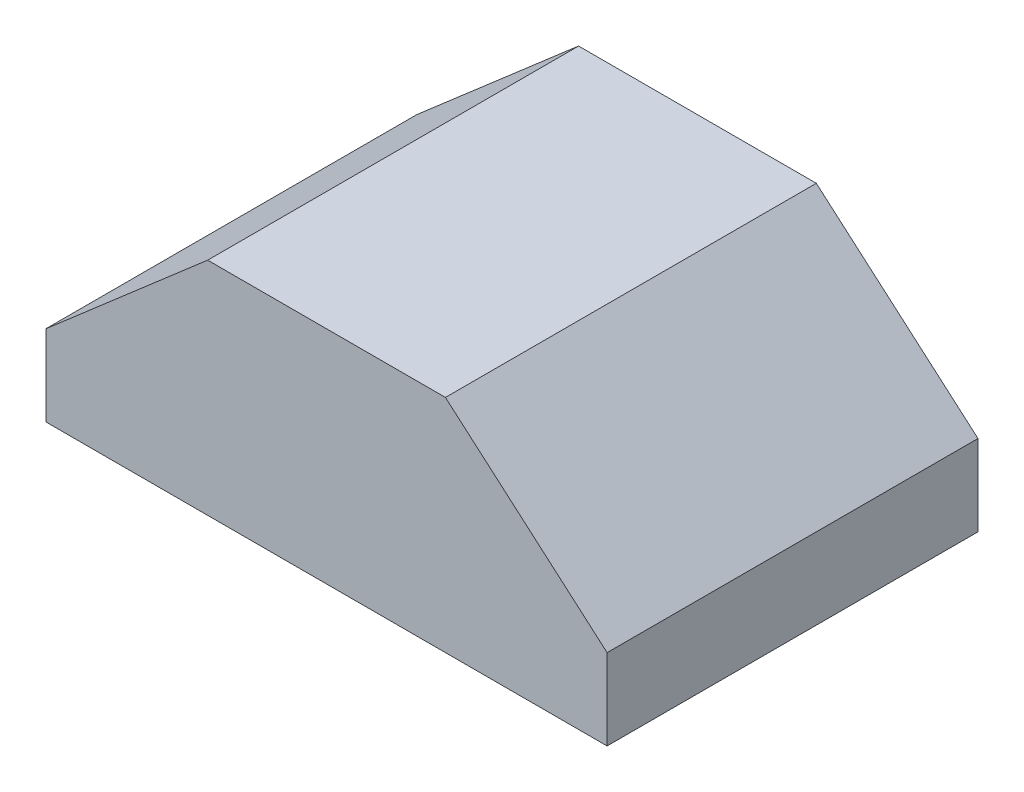
ISO-10303-21;
HEADER;
FILE_DESCRIPTION(('STEP AP214'),'2;1');
FILE_NAME('part.step','',(''),(''),'','','');
FILE_SCHEMA(('AUTOMOTIVE_DESIGN { 1 0 10303 214 1 1 1 1 }'));
ENDSEC;
DATA;
#1=APPLICATION_CONTEXT('core data for automotive mechanical design processes');
#2=APPLICATION_PROTOCOL_DEFINITION('international standard','automotive_design',2000,#1);
#3=PRODUCT_CONTEXT('',#1,'mechanical');
#4=PRODUCT('Part','Part','',(#3));
#5=PRODUCT_RELATED_PRODUCT_CATEGORY('part','',(#4));
#6=PRODUCT_DEFINITION_FORMATION('','',#4);
#7=PRODUCT_DEFINITION_CONTEXT('part definition',#1,'design');
#8=PRODUCT_DEFINITION('design','',#6,#7);
#9=PRODUCT_DEFINITION_SHAPE('','',#8);
#10=(LENGTH_UNIT() NAMED_UNIT(*) SI_UNIT(.MILLI.,.METRE.));
#11=(NAMED_UNIT(*) PLANE_ANGLE_UNIT() SI_UNIT($,.RADIAN.));
#12=(NAMED_UNIT(*) SI_UNIT($,.STERADIAN.) SOLID_ANGLE_UNIT());
#13=UNCERTAINTY_MEASURE_WITH_UNIT(LENGTH_MEASURE(1.E-05),#10,'distance_accuracy_value','');
#14=(GEOMETRIC_REPRESENTATION_CONTEXT(3) GLOBAL_UNCERTAINTY_ASSIGNED_CONTEXT((#13)) GLOBAL_UNIT_ASSIGNED_CONTEXT((#10,
#11,#12)) REPRESENTATION_CONTEXT('',''));
#15=CARTESIAN_POINT('',(0.,0.,0.));
#16=DIRECTION('',(0.,0.,1.));
#17=DIRECTION('',(1.,0.,0.));
#18=AXIS2_PLACEMENT_3D('',#15,#16,#17);
#19=CARTESIAN_POINT('',(-2950.,850.,3900.));
#20=DIRECTION('',(1.,0.,0.));
#21=DIRECTION('',(0.,0.,-1.));
#22=AXIS2_PLACEMENT_3D('',#19,#20,#21);
#23=PLANE('',#22);
#24=DIRECTION('',(0.,-1.,0.));
#25=VECTOR('',#24,1.);
#26=CARTESIAN_POINT('',(-2950.,850.,0.));
#27=LINE('',#26,#25);
#28=CARTESIAN_POINT('',(-2950.,850.,0.));
#29=VERTEX_POINT('',#28);
#30=CARTESIAN_POINT('',(-2950.,3.56795033927606E-13,0.));
#31=VERTEX_POINT('',#30);
#32=EDGE_CURVE('E119',#29,#31,#27,.T.);
#33=ORIENTED_EDGE('',*,*,#32,.T.);
#34=DIRECTION('',(0.,0.,-1.));
#35=VECTOR('',#34,1.);
#36=CARTESIAN_POINT('',(-2950.,3.56795033927606E-13,3900.));
#37=LINE('',#36,#35);
#38=CARTESIAN_POINT('',(-2950.,3.56795033927606E-13,3900.));
#39=VERTEX_POINT('',#38);
#40=EDGE_CURVE('E11',#39,#31,#37,.T.);
#41=ORIENTED_EDGE('',*,*,#40,.F.);
#42=DIRECTION('',(0.,-1.,0.));
#43=VECTOR('',#42,1.);
#44=CARTESIAN_POINT('',(-2950.,850.,3900.));
#45=LINE('',#44,#43);
#46=CARTESIAN_POINT('',(-2950.,850.,3900.));
#47=VERTEX_POINT('',#46);
#48=EDGE_CURVE('E129',#47,#39,#45,.T.);
#49=ORIENTED_EDGE('',*,*,#48,.F.);
#50=DIRECTION('',(0.,0.,-1.));
#51=VECTOR('',#50,1.);
#52=CARTESIAN_POINT('',(-2950.,850.,3900.));
#53=LINE('',#52,#51);
#54=EDGE_CURVE('E115',#47,#29,#53,.T.);
#55=ORIENTED_EDGE('',*,*,#54,.T.);
#56=EDGE_LOOP('',(#33,#41,#49,#55));
#57=FACE_BOUND('',#56,.T.);
#58=ADVANCED_FACE('F35',(#57),#23,.F.);
#59=CARTESIAN_POINT('',(2950.,3.56795033927606E-13,3900.));
#60=DIRECTION('',(0.,1.,0.));
#61=DIRECTION('',(0.,0.,1.));
#62=AXIS2_PLACEMENT_3D('',#59,#60,#61);
#63=PLANE('',#62);
#64=DIRECTION('',(1.,0.,0.));
#65=VECTOR('',#64,1.);
#66=CARTESIAN_POINT('',(2950.,3.56795033927606E-13,0.));
#67=LINE('',#66,#65);
#68=CARTESIAN_POINT('',(2950.,3.56795033927606E-13,0.));
#69=VERTEX_POINT('',#68);
#70=EDGE_CURVE('E122',#31,#69,#67,.T.);
#71=ORIENTED_EDGE('',*,*,#70,.T.);
#72=DIRECTION('',(0.,0.,-1.));
#73=VECTOR('',#72,1.);
#74=CARTESIAN_POINT('',(2950.,3.56795033927606E-13,3900.));
#75=LINE('',#74,#73);
#76=CARTESIAN_POINT('',(2950.,3.56795033927606E-13,3900.));
#77=VERTEX_POINT('',#76);
#78=EDGE_CURVE('E43',#77,#69,#75,.T.);
#79=ORIENTED_EDGE('',*,*,#78,.F.);
#80=DIRECTION('',(1.,0.,0.));
#81=VECTOR('',#80,1.);
#82=CARTESIAN_POINT('',(2950.,3.56795033927606E-13,3900.));
#83=LINE('',#82,#81);
#84=EDGE_CURVE('E88',#39,#77,#83,.T.);
#85=ORIENTED_EDGE('',*,*,#84,.F.);
#86=ORIENTED_EDGE('',*,*,#40,.T.);
#87=EDGE_LOOP('',(#71,#79,#85,#86));
#88=FACE_BOUND('',#87,.T.);
#89=ADVANCED_FACE('F153',(#88),#63,.F.);
#90=CARTESIAN_POINT('',(2950.,850.,3900.));
#91=DIRECTION('',(-1.,0.,0.));
#92=DIRECTION('',(0.,0.,1.));
#93=AXIS2_PLACEMENT_3D('',#90,#91,#92);
#94=PLANE('',#93);
#95=DIRECTION('',(0.,1.,0.));
#96=VECTOR('',#95,1.);
#97=CARTESIAN_POINT('',(2950.,850.,0.));
#98=LINE('',#97,#96);
#99=CARTESIAN_POINT('',(2950.,850.,0.));
#100=VERTEX_POINT('',#99);
#101=EDGE_CURVE('E124',#69,#100,#98,.T.);
#102=ORIENTED_EDGE('',*,*,#101,.T.);
#103=DIRECTION('',(0.,0.,-1.));
#104=VECTOR('',#103,1.);
#105=CARTESIAN_POINT('',(2950.,850.,3900.));
#106=LINE('',#105,#104);
#107=CARTESIAN_POINT('',(2950.,850.,3900.));
#108=VERTEX_POINT('',#107);
#109=EDGE_CURVE('E110',#108,#100,#106,.T.);
#110=ORIENTED_EDGE('',*,*,#109,.F.);
#111=DIRECTION('',(0.,1.,0.));
#112=VECTOR('',#111,1.);
#113=CARTESIAN_POINT('',(2950.,850.,3900.));
#114=LINE('',#113,#112);
#115=EDGE_CURVE('E101',#77,#108,#114,.T.);
#116=ORIENTED_EDGE('',*,*,#115,.F.);
#117=ORIENTED_EDGE('',*,*,#78,.T.);
#118=EDGE_LOOP('',(#102,#110,#116,#117));
#119=FACE_BOUND('',#118,.T.);
#120=ADVANCED_FACE('F135',(#119),#94,.F.);
#121=CARTESIAN_POINT('',(1250.,2323.94029729837,3900.));
#122=DIRECTION('',(-0.655084576577052,-0.755555555555556,0.));
#123=DIRECTION('',(0.755555555555556,-0.655084576577052,0.));
#124=AXIS2_PLACEMENT_3D('',#121,#122,#123);
#125=PLANE('',#124);
#126=DIRECTION('',(-0.755555555555556,0.655084576577052,0.));
#127=VECTOR('',#126,1.);
#128=CARTESIAN_POINT('',(1250.,2323.94029729837,0.));
#129=LINE('',#128,#127);
#130=CARTESIAN_POINT('',(1250.,2323.94029729837,0.));
#131=VERTEX_POINT('',#130);
#132=EDGE_CURVE('E109',#100,#131,#129,.T.);
#133=ORIENTED_EDGE('',*,*,#132,.T.);
#134=DIRECTION('',(0.,0.,-1.));
#135=VECTOR('',#134,1.);
#136=CARTESIAN_POINT('',(1250.,2323.94029729837,3900.));
#137=LINE('',#136,#135);
#138=CARTESIAN_POINT('',(1250.,2323.94029729837,3900.));
#139=VERTEX_POINT('',#138);
#140=EDGE_CURVE('E106',#139,#131,#137,.T.);
#141=ORIENTED_EDGE('',*,*,#140,.F.);
#142=DIRECTION('',(-0.755555555555556,0.655084576577052,0.));
#143=VECTOR('',#142,1.);
#144=CARTESIAN_POINT('',(1250.,2323.94029729837,3900.));
#145=LINE('',#144,#143);
#146=EDGE_CURVE('E95',#108,#139,#145,.T.);
#147=ORIENTED_EDGE('',*,*,#146,.F.);
#148=ORIENTED_EDGE('',*,*,#109,.T.);
#149=EDGE_LOOP('',(#133,#141,#147,#148));
#150=FACE_BOUND('',#149,.T.);
#151=ADVANCED_FACE('F107',(#150),#125,.F.);
#152=CARTESIAN_POINT('',(-1250.,2323.94029729837,3900.));
#153=DIRECTION('',(0.,-1.,0.));
#154=DIRECTION('',(0.,0.,-1.));
#155=AXIS2_PLACEMENT_3D('',#152,#153,#154);
#156=PLANE('',#155);
#157=DIRECTION('',(-1.,0.,0.));
#158=VECTOR('',#157,1.);
#159=CARTESIAN_POINT('',(-1250.,2323.94029729837,0.));
#160=LINE('',#159,#158);
#161=CARTESIAN_POINT('',(-1250.,2323.94029729837,0.));
#162=VERTEX_POINT('',#161);
#163=EDGE_CURVE('E74',#131,#162,#160,.T.);
#164=ORIENTED_EDGE('',*,*,#163,.T.);
#165=DIRECTION('',(0.,0.,-1.));
#166=VECTOR('',#165,1.);
#167=CARTESIAN_POINT('',(-1250.,2323.94029729837,3900.));
#168=LINE('',#167,#166);
#169=CARTESIAN_POINT('',(-1250.,2323.94029729837,3900.));
#170=VERTEX_POINT('',#169);
#171=EDGE_CURVE('E111',#170,#162,#168,.T.);
#172=ORIENTED_EDGE('',*,*,#171,.F.);
#173=DIRECTION('',(-1.,0.,0.));
#174=VECTOR('',#173,1.);
#175=CARTESIAN_POINT('',(-1250.,2323.94029729837,3900.));
#176=LINE('',#175,#174);
#177=EDGE_CURVE('E99',#139,#170,#176,.T.);
#178=ORIENTED_EDGE('',*,*,#177,.F.);
#179=ORIENTED_EDGE('',*,*,#140,.T.);
#180=EDGE_LOOP('',(#164,#172,#178,#179));
#181=FACE_BOUND('',#180,.T.);
#182=ADVANCED_FACE('F113',(#181),#156,.F.);
#183=CARTESIAN_POINT('',(-1250.,2323.94029729837,3900.));
#184=DIRECTION('',(0.655084576577052,-0.755555555555556,0.));
#185=DIRECTION('',(0.755555555555556,0.655084576577052,0.));
#186=AXIS2_PLACEMENT_3D('',#183,#184,#185);
#187=PLANE('',#186);
#188=DIRECTION('',(-0.755555555555556,-0.655084576577052,0.));
#189=VECTOR('',#188,1.);
#190=CARTESIAN_POINT('',(-1250.,2323.94029729837,0.));
#191=LINE('',#190,#189);
#192=EDGE_CURVE('E80',#162,#29,#191,.T.);
#193=ORIENTED_EDGE('',*,*,#192,.T.);
#194=ORIENTED_EDGE('',*,*,#54,.F.);
#195=DIRECTION('',(-0.755555555555556,-0.655084576577052,0.));
#196=VECTOR('',#195,1.);
#197=CARTESIAN_POINT('',(-1250.,2323.94029729837,3900.));
#198=LINE('',#197,#196);
#199=EDGE_CURVE('E51',#170,#47,#198,.T.);
#200=ORIENTED_EDGE('',*,*,#199,.F.);
#201=ORIENTED_EDGE('',*,*,#171,.T.);
#202=EDGE_LOOP('',(#193,#194,#200,#201));
#203=FACE_BOUND('',#202,.T.);
#204=ADVANCED_FACE('F142',(#203),#187,.F.);
#205=CARTESIAN_POINT('',(0.,0.,3900.));
#206=DIRECTION('',(0.,0.,-1.));
#207=DIRECTION('',(-1.,0.,0.));
#208=AXIS2_PLACEMENT_3D('',#205,#206,#207);
#209=PLANE('',#208);
#210=ORIENTED_EDGE('',*,*,#48,.T.);
#211=ORIENTED_EDGE('',*,*,#84,.T.);
#212=ORIENTED_EDGE('',*,*,#115,.T.);
#213=ORIENTED_EDGE('',*,*,#146,.T.);
#214=ORIENTED_EDGE('',*,*,#177,.T.);
#215=ORIENTED_EDGE('',*,*,#199,.T.);
#216=EDGE_LOOP('',(#210,#211,#212,#213,#214,#215));
#217=FACE_BOUND('',#216,.T.);
#218=ADVANCED_FACE('F97',(#217),#209,.F.);
#219=CARTESIAN_POINT('',(0.,0.,0.));
#220=DIRECTION('',(0.,0.,-1.));
#221=DIRECTION('',(-1.,0.,0.));
#222=AXIS2_PLACEMENT_3D('',#219,#220,#221);
#223=PLANE('',#222);
#224=ORIENTED_EDGE('',*,*,#32,.F.);
#225=ORIENTED_EDGE('',*,*,#192,.F.);
#226=ORIENTED_EDGE('',*,*,#163,.F.);
#227=ORIENTED_EDGE('',*,*,#132,.F.);
#228=ORIENTED_EDGE('',*,*,#101,.F.);
#229=ORIENTED_EDGE('',*,*,#70,.F.);
#230=EDGE_LOOP('',(#224,#225,#226,#227,#228,#229));
#231=FACE_BOUND('',#230,.T.);
#232=ADVANCED_FACE('F138',(#231),#223,.T.);
#233=CLOSED_SHELL('',(#58,#89,#120,#151,#182,#204,#218,#232));
#234=MANIFOLD_SOLID_BREP('B2',#233);
#235=ADVANCED_BREP_SHAPE_REPRESENTATION('',(#18,#234),#14);
#236=SHAPE_DEFINITION_REPRESENTATION(#9,#235);
ENDSEC;
END-ISO-10303-21;
